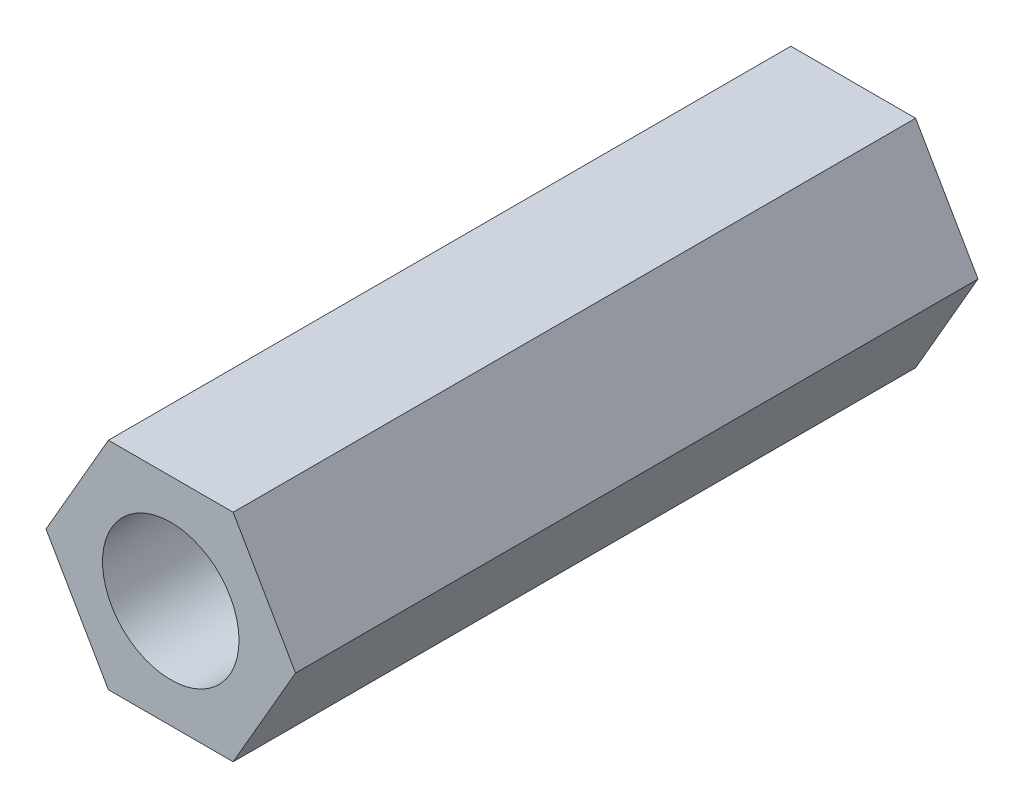
ISO-10303-21;
HEADER;
FILE_DESCRIPTION(('STEP AP214'),'2;1');
FILE_NAME('part.step','',(''),(''),'','','');
FILE_SCHEMA(('AUTOMOTIVE_DESIGN { 1 0 10303 214 1 1 1 1 }'));
ENDSEC;
DATA;
#1=APPLICATION_CONTEXT('core data for automotive mechanical design processes');
#2=APPLICATION_PROTOCOL_DEFINITION('international standard','automotive_design',2000,#1);
#3=PRODUCT_CONTEXT('',#1,'mechanical');
#4=PRODUCT('Part','Part','',(#3));
#5=PRODUCT_RELATED_PRODUCT_CATEGORY('part','',(#4));
#6=PRODUCT_DEFINITION_FORMATION('','',#4);
#7=PRODUCT_DEFINITION_CONTEXT('part definition',#1,'design');
#8=PRODUCT_DEFINITION('design','',#6,#7);
#9=PRODUCT_DEFINITION_SHAPE('','',#8);
#10=(LENGTH_UNIT() NAMED_UNIT(*) SI_UNIT(.MILLI.,.METRE.));
#11=(NAMED_UNIT(*) PLANE_ANGLE_UNIT() SI_UNIT($,.RADIAN.));
#12=(NAMED_UNIT(*) SI_UNIT($,.STERADIAN.) SOLID_ANGLE_UNIT());
#13=UNCERTAINTY_MEASURE_WITH_UNIT(LENGTH_MEASURE(1.E-05),#10,'distance_accuracy_value','');
#14=(GEOMETRIC_REPRESENTATION_CONTEXT(3) GLOBAL_UNCERTAINTY_ASSIGNED_CONTEXT((#13)) GLOBAL_UNIT_ASSIGNED_CONTEXT((#10,
#11,#12)) REPRESENTATION_CONTEXT('',''));
#15=CARTESIAN_POINT('',(0.,0.,0.));
#16=DIRECTION('',(0.,0.,1.));
#17=DIRECTION('',(1.,0.,0.));
#18=AXIS2_PLACEMENT_3D('',#15,#16,#17);
#19=CARTESIAN_POINT('',(0.,0.,15.));
#20=DIRECTION('',(0.,0.,1.));
#21=DIRECTION('',(1.,0.,0.));
#22=AXIS2_PLACEMENT_3D('',#19,#20,#21);
#23=PLANE('',#22);
#24=DIRECTION('',(0.499999999999995,0.866025403784441,0.));
#25=VECTOR('',#24,1.);
#26=CARTESIAN_POINT('',(1.37120688932539,-2.37499999999999,15.));
#27=LINE('',#26,#25);
#28=CARTESIAN_POINT('',(1.37120688932539,-2.37499999999999,15.));
#29=VERTEX_POINT('',#28);
#30=CARTESIAN_POINT('',(2.74241377865072,0.,15.));
#31=VERTEX_POINT('',#30);
#32=EDGE_CURVE('E137',#29,#31,#27,.T.);
#33=ORIENTED_EDGE('',*,*,#32,.T.);
#34=DIRECTION('',(-0.500000000000001,0.866025403784438,0.));
#35=VECTOR('',#34,1.);
#36=CARTESIAN_POINT('',(2.74241377865072,0.,15.));
#37=LINE('',#36,#35);
#38=CARTESIAN_POINT('',(1.37120688932536,2.375,15.));
#39=VERTEX_POINT('',#38);
#40=EDGE_CURVE('E95',#31,#39,#37,.T.);
#41=ORIENTED_EDGE('',*,*,#40,.T.);
#42=DIRECTION('',(-1.,0.,0.));
#43=VECTOR('',#42,1.);
#44=CARTESIAN_POINT('',(1.37120688932536,2.375,15.));
#45=LINE('',#44,#43);
#46=CARTESIAN_POINT('',(-1.37120688932537,2.375,15.));
#47=VERTEX_POINT('',#46);
#48=EDGE_CURVE('E108',#39,#47,#45,.T.);
#49=ORIENTED_EDGE('',*,*,#48,.T.);
#50=DIRECTION('',(-0.499999999999995,-0.866025403784442,0.));
#51=VECTOR('',#50,1.);
#52=CARTESIAN_POINT('',(-1.37120688932537,2.375,15.));
#53=LINE('',#52,#51);
#54=CARTESIAN_POINT('',(-2.74241377865072,0.,15.));
#55=VERTEX_POINT('',#54);
#56=EDGE_CURVE('E102',#47,#55,#53,.T.);
#57=ORIENTED_EDGE('',*,*,#56,.T.);
#58=DIRECTION('',(0.500000000000007,-0.866025403784435,0.));
#59=VECTOR('',#58,1.);
#60=CARTESIAN_POINT('',(-2.74241377865072,0.,15.));
#61=LINE('',#60,#59);
#62=CARTESIAN_POINT('',(-1.37120688932534,-2.37500000000001,15.));
#63=VERTEX_POINT('',#62);
#64=EDGE_CURVE('E106',#55,#63,#61,.T.);
#65=ORIENTED_EDGE('',*,*,#64,.T.);
#66=DIRECTION('',(1.,0.,0.));
#67=VECTOR('',#66,1.);
#68=CARTESIAN_POINT('',(-1.37120688932534,-2.37500000000001,15.));
#69=LINE('',#68,#67);
#70=EDGE_CURVE('E58',#63,#29,#69,.T.);
#71=ORIENTED_EDGE('',*,*,#70,.T.);
#72=EDGE_LOOP('',(#33,#41,#49,#57,#65,#71));
#73=FACE_BOUND('',#72,.T.);
#74=CARTESIAN_POINT('',(0.,0.,15.));
#75=DIRECTION('',(0.,0.,1.));
#76=DIRECTION('',(1.,0.,0.));
#77=AXIS2_PLACEMENT_3D('',#74,#75,#76);
#78=CIRCLE('',#77,1.5);
#79=CARTESIAN_POINT('',(1.5,0.,15.));
#80=VERTEX_POINT('',#79);
#81=EDGE_CURVE('E130',#80,#80,#78,.T.);
#82=ORIENTED_EDGE('',*,*,#81,.F.);
#83=EDGE_LOOP('',(#82));
#84=FACE_BOUND('',#83,.T.);
#85=ADVANCED_FACE('F41',(#73,#84),#23,.T.);
#86=CARTESIAN_POINT('',(0.,0.,0.));
#87=DIRECTION('',(0.,0.,1.));
#88=DIRECTION('',(1.,0.,0.));
#89=AXIS2_PLACEMENT_3D('',#86,#87,#88);
#90=PLANE('',#89);
#91=DIRECTION('',(0.499999999999995,0.866025403784441,0.));
#92=VECTOR('',#91,1.);
#93=CARTESIAN_POINT('',(1.37120688932539,-2.37499999999999,0.));
#94=LINE('',#93,#92);
#95=CARTESIAN_POINT('',(1.37120688932539,-2.37499999999999,0.));
#96=VERTEX_POINT('',#95);
#97=CARTESIAN_POINT('',(2.74241377865072,0.,0.));
#98=VERTEX_POINT('',#97);
#99=EDGE_CURVE('E126',#96,#98,#94,.T.);
#100=ORIENTED_EDGE('',*,*,#99,.F.);
#101=DIRECTION('',(1.,0.,0.));
#102=VECTOR('',#101,1.);
#103=CARTESIAN_POINT('',(-1.37120688932534,-2.37500000000001,0.));
#104=LINE('',#103,#102);
#105=CARTESIAN_POINT('',(-1.37120688932534,-2.37500000000001,0.));
#106=VERTEX_POINT('',#105);
#107=EDGE_CURVE('E87',#106,#96,#104,.T.);
#108=ORIENTED_EDGE('',*,*,#107,.F.);
#109=DIRECTION('',(0.500000000000007,-0.866025403784435,0.));
#110=VECTOR('',#109,1.);
#111=CARTESIAN_POINT('',(-2.74241377865072,0.,0.));
#112=LINE('',#111,#110);
#113=CARTESIAN_POINT('',(-2.74241377865072,0.,0.));
#114=VERTEX_POINT('',#113);
#115=EDGE_CURVE('E81',#114,#106,#112,.T.);
#116=ORIENTED_EDGE('',*,*,#115,.F.);
#117=DIRECTION('',(-0.499999999999995,-0.866025403784442,0.));
#118=VECTOR('',#117,1.);
#119=CARTESIAN_POINT('',(-1.37120688932537,2.375,0.));
#120=LINE('',#119,#118);
#121=CARTESIAN_POINT('',(-1.37120688932537,2.375,0.));
#122=VERTEX_POINT('',#121);
#123=EDGE_CURVE('E116',#122,#114,#120,.T.);
#124=ORIENTED_EDGE('',*,*,#123,.F.);
#125=DIRECTION('',(-1.,0.,0.));
#126=VECTOR('',#125,1.);
#127=CARTESIAN_POINT('',(1.37120688932536,2.375,0.));
#128=LINE('',#127,#126);
#129=CARTESIAN_POINT('',(1.37120688932536,2.375,0.));
#130=VERTEX_POINT('',#129);
#131=EDGE_CURVE('E132',#130,#122,#128,.T.);
#132=ORIENTED_EDGE('',*,*,#131,.F.);
#133=DIRECTION('',(-0.500000000000001,0.866025403784438,0.));
#134=VECTOR('',#133,1.);
#135=CARTESIAN_POINT('',(2.74241377865072,0.,0.));
#136=LINE('',#135,#134);
#137=EDGE_CURVE('E129',#98,#130,#136,.T.);
#138=ORIENTED_EDGE('',*,*,#137,.F.);
#139=EDGE_LOOP('',(#100,#108,#116,#124,#132,#138));
#140=FACE_BOUND('',#139,.T.);
#141=CARTESIAN_POINT('',(0.,0.,0.));
#142=DIRECTION('',(0.,0.,1.));
#143=DIRECTION('',(1.,0.,0.));
#144=AXIS2_PLACEMENT_3D('',#141,#142,#143);
#145=CIRCLE('',#144,1.5);
#146=CARTESIAN_POINT('',(1.5,0.,0.));
#147=VERTEX_POINT('',#146);
#148=EDGE_CURVE('E230',#147,#147,#145,.T.);
#149=ORIENTED_EDGE('',*,*,#148,.T.);
#150=EDGE_LOOP('',(#149));
#151=FACE_BOUND('',#150,.T.);
#152=ADVANCED_FACE('F146',(#140,#151),#90,.F.);
#153=CARTESIAN_POINT('',(1.37120688932539,-2.37499999999999,15.));
#154=DIRECTION('',(-0.866025403784441,0.499999999999995,0.));
#155=DIRECTION('',(-0.499999999999995,-0.866025403784441,0.));
#156=AXIS2_PLACEMENT_3D('',#153,#154,#155);
#157=PLANE('',#156);
#158=ORIENTED_EDGE('',*,*,#99,.T.);
#159=DIRECTION('',(0.,0.,-1.));
#160=VECTOR('',#159,1.);
#161=CARTESIAN_POINT('',(2.74241377865072,0.,15.));
#162=LINE('',#161,#160);
#163=EDGE_CURVE('E11',#31,#98,#162,.T.);
#164=ORIENTED_EDGE('',*,*,#163,.F.);
#165=ORIENTED_EDGE('',*,*,#32,.F.);
#166=DIRECTION('',(0.,0.,-1.));
#167=VECTOR('',#166,1.);
#168=CARTESIAN_POINT('',(1.37120688932539,-2.37499999999999,15.));
#169=LINE('',#168,#167);
#170=EDGE_CURVE('E122',#29,#96,#169,.T.);
#171=ORIENTED_EDGE('',*,*,#170,.T.);
#172=EDGE_LOOP('',(#158,#164,#165,#171));
#173=FACE_BOUND('',#172,.T.);
#174=ADVANCED_FACE('F43',(#173),#157,.F.);
#175=CARTESIAN_POINT('',(2.74241377865072,0.,15.));
#176=DIRECTION('',(-0.866025403784438,-0.500000000000001,0.));
#177=DIRECTION('',(0.500000000000001,-0.866025403784438,0.));
#178=AXIS2_PLACEMENT_3D('',#175,#176,#177);
#179=PLANE('',#178);
#180=ORIENTED_EDGE('',*,*,#137,.T.);
#181=DIRECTION('',(0.,0.,-1.));
#182=VECTOR('',#181,1.);
#183=CARTESIAN_POINT('',(1.37120688932536,2.375,15.));
#184=LINE('',#183,#182);
#185=EDGE_CURVE('E50',#39,#130,#184,.T.);
#186=ORIENTED_EDGE('',*,*,#185,.F.);
#187=ORIENTED_EDGE('',*,*,#40,.F.);
#188=ORIENTED_EDGE('',*,*,#163,.T.);
#189=EDGE_LOOP('',(#180,#186,#187,#188));
#190=FACE_BOUND('',#189,.T.);
#191=ADVANCED_FACE('F171',(#190),#179,.F.);
#192=CARTESIAN_POINT('',(1.37120688932536,2.375,15.));
#193=DIRECTION('',(0.,-1.,0.));
#194=DIRECTION('',(1.,0.,0.));
#195=AXIS2_PLACEMENT_3D('',#192,#193,#194);
#196=PLANE('',#195);
#197=ORIENTED_EDGE('',*,*,#131,.T.);
#198=DIRECTION('',(0.,0.,-1.));
#199=VECTOR('',#198,1.);
#200=CARTESIAN_POINT('',(-1.37120688932537,2.375,15.));
#201=LINE('',#200,#199);
#202=EDGE_CURVE('E117',#47,#122,#201,.T.);
#203=ORIENTED_EDGE('',*,*,#202,.F.);
#204=ORIENTED_EDGE('',*,*,#48,.F.);
#205=ORIENTED_EDGE('',*,*,#185,.T.);
#206=EDGE_LOOP('',(#197,#203,#204,#205));
#207=FACE_BOUND('',#206,.T.);
#208=ADVANCED_FACE('F143',(#207),#196,.F.);
#209=CARTESIAN_POINT('',(-1.37120688932537,2.375,15.));
#210=DIRECTION('',(0.866025403784441,-0.499999999999995,0.));
#211=DIRECTION('',(0.499999999999995,0.866025403784442,0.));
#212=AXIS2_PLACEMENT_3D('',#209,#210,#211);
#213=PLANE('',#212);
#214=ORIENTED_EDGE('',*,*,#123,.T.);
#215=DIRECTION('',(0.,0.,-1.));
#216=VECTOR('',#215,1.);
#217=CARTESIAN_POINT('',(-2.74241377865072,0.,15.));
#218=LINE('',#217,#216);
#219=EDGE_CURVE('E113',#55,#114,#218,.T.);
#220=ORIENTED_EDGE('',*,*,#219,.F.);
#221=ORIENTED_EDGE('',*,*,#56,.F.);
#222=ORIENTED_EDGE('',*,*,#202,.T.);
#223=EDGE_LOOP('',(#214,#220,#221,#222));
#224=FACE_BOUND('',#223,.T.);
#225=ADVANCED_FACE('F114',(#224),#213,.F.);
#226=CARTESIAN_POINT('',(-2.74241377865072,0.,15.));
#227=DIRECTION('',(0.866025403784435,0.500000000000007,0.));
#228=DIRECTION('',(-0.500000000000007,0.866025403784435,0.));
#229=AXIS2_PLACEMENT_3D('',#226,#227,#228);
#230=PLANE('',#229);
#231=ORIENTED_EDGE('',*,*,#115,.T.);
#232=DIRECTION('',(0.,0.,-1.));
#233=VECTOR('',#232,1.);
#234=CARTESIAN_POINT('',(-1.37120688932534,-2.37500000000001,15.));
#235=LINE('',#234,#233);
#236=EDGE_CURVE('E118',#63,#106,#235,.T.);
#237=ORIENTED_EDGE('',*,*,#236,.F.);
#238=ORIENTED_EDGE('',*,*,#64,.F.);
#239=ORIENTED_EDGE('',*,*,#219,.T.);
#240=EDGE_LOOP('',(#231,#237,#238,#239));
#241=FACE_BOUND('',#240,.T.);
#242=ADVANCED_FACE('F120',(#241),#230,.F.);
#243=CARTESIAN_POINT('',(-1.37120688932534,-2.37500000000001,15.));
#244=DIRECTION('',(0.,1.,0.));
#245=DIRECTION('',(-1.,0.,0.));
#246=AXIS2_PLACEMENT_3D('',#243,#244,#245);
#247=PLANE('',#246);
#248=ORIENTED_EDGE('',*,*,#107,.T.);
#249=ORIENTED_EDGE('',*,*,#170,.F.);
#250=ORIENTED_EDGE('',*,*,#70,.F.);
#251=ORIENTED_EDGE('',*,*,#236,.T.);
#252=EDGE_LOOP('',(#248,#249,#250,#251));
#253=FACE_BOUND('',#252,.T.);
#254=ADVANCED_FACE('F151',(#253),#247,.F.);
#255=CARTESIAN_POINT('',(0.,0.,15.));
#256=DIRECTION('',(0.,0.,-1.));
#257=DIRECTION('',(-1.,0.,0.));
#258=AXIS2_PLACEMENT_3D('',#255,#256,#257);
#259=CYLINDRICAL_SURFACE('',#258,1.5);
#260=ORIENTED_EDGE('',*,*,#81,.T.);
#261=EDGE_LOOP('',(#260));
#262=FACE_BOUND('',#261,.T.);
#263=ORIENTED_EDGE('',*,*,#148,.F.);
#264=EDGE_LOOP('',(#263));
#265=FACE_BOUND('',#264,.T.);
#266=ADVANCED_FACE('F153',(#262,#265),#259,.F.);
#267=CLOSED_SHELL('',(#85,#152,#174,#191,#208,#225,#242,#254,#266));
#268=MANIFOLD_SOLID_BREP('B2',#267);
#269=ADVANCED_BREP_SHAPE_REPRESENTATION('',(#18,#268),#14);
#270=SHAPE_DEFINITION_REPRESENTATION(#9,#269);
ENDSEC;
END-ISO-10303-21;
